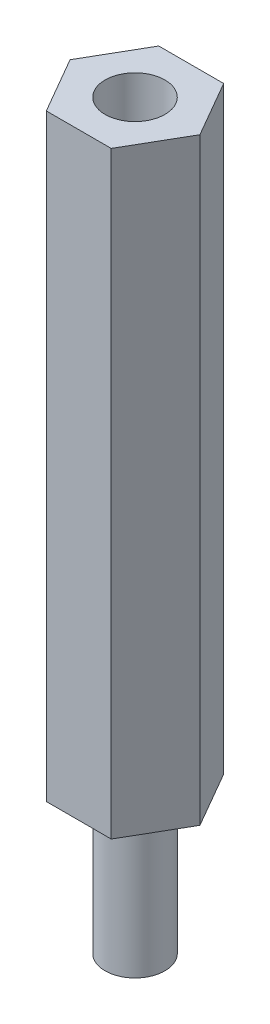
ISO-10303-21;
HEADER;
FILE_DESCRIPTION(('STEP AP214'),'2;1');
FILE_NAME('part.step','',(''),(''),'','','');
FILE_SCHEMA(('AUTOMOTIVE_DESIGN { 1 0 10303 214 1 1 1 1 }'));
ENDSEC;
DATA;
#1=APPLICATION_CONTEXT('core data for automotive mechanical design processes');
#2=APPLICATION_PROTOCOL_DEFINITION('international standard','automotive_design',2000,#1);
#3=PRODUCT_CONTEXT('',#1,'mechanical');
#4=PRODUCT('Part','Part','',(#3));
#5=PRODUCT_RELATED_PRODUCT_CATEGORY('part','',(#4));
#6=PRODUCT_DEFINITION_FORMATION('','',#4);
#7=PRODUCT_DEFINITION_CONTEXT('part definition',#1,'design');
#8=PRODUCT_DEFINITION('design','',#6,#7);
#9=PRODUCT_DEFINITION_SHAPE('','',#8);
#10=(LENGTH_UNIT() NAMED_UNIT(*) SI_UNIT(.MILLI.,.METRE.));
#11=(NAMED_UNIT(*) PLANE_ANGLE_UNIT() SI_UNIT($,.RADIAN.));
#12=(NAMED_UNIT(*) SI_UNIT($,.STERADIAN.) SOLID_ANGLE_UNIT());
#13=UNCERTAINTY_MEASURE_WITH_UNIT(LENGTH_MEASURE(1.E-05),#10,'distance_accuracy_value','');
#14=(GEOMETRIC_REPRESENTATION_CONTEXT(3) GLOBAL_UNCERTAINTY_ASSIGNED_CONTEXT((#13)) GLOBAL_UNIT_ASSIGNED_CONTEXT((#10,
#11,#12)) REPRESENTATION_CONTEXT('',''));
#15=CARTESIAN_POINT('',(0.,0.,0.));
#16=DIRECTION('',(0.,0.,1.));
#17=DIRECTION('',(1.,0.,0.));
#18=AXIS2_PLACEMENT_3D('',#15,#16,#17);
#19=CARTESIAN_POINT('',(0.,25.,0.));
#20=DIRECTION('',(0.,1.,0.));
#21=DIRECTION('',(0.,0.,1.));
#22=AXIS2_PLACEMENT_3D('',#19,#20,#21);
#23=PLANE('',#22);
#24=DIRECTION('',(-0.5,0.,-0.866025403784438));
#25=VECTOR('',#24,1.);
#26=CARTESIAN_POINT('',(2.71354626519124,25.,0.));
#27=LINE('',#26,#25);
#28=CARTESIAN_POINT('',(2.71354626519124,25.,0.));
#29=VERTEX_POINT('',#28);
#30=CARTESIAN_POINT('',(1.35677313259562,25.,-2.35));
#31=VERTEX_POINT('',#30);
#32=EDGE_CURVE('E134',#29,#31,#27,.T.);
#33=ORIENTED_EDGE('',*,*,#32,.T.);
#34=DIRECTION('',(-1.,0.,0.));
#35=VECTOR('',#34,1.);
#36=CARTESIAN_POINT('',(1.35677313259562,25.,-2.35));
#37=LINE('',#36,#35);
#38=CARTESIAN_POINT('',(-1.35677313259562,25.,-2.35));
#39=VERTEX_POINT('',#38);
#40=EDGE_CURVE('E92',#31,#39,#37,.T.);
#41=ORIENTED_EDGE('',*,*,#40,.T.);
#42=DIRECTION('',(-0.5,0.,0.866025403784438));
#43=VECTOR('',#42,1.);
#44=CARTESIAN_POINT('',(-1.35677313259562,25.,-2.35));
#45=LINE('',#44,#43);
#46=CARTESIAN_POINT('',(-2.71354626519124,25.,0.));
#47=VERTEX_POINT('',#46);
#48=EDGE_CURVE('E105',#39,#47,#45,.T.);
#49=ORIENTED_EDGE('',*,*,#48,.T.);
#50=DIRECTION('',(0.5,0.,0.866025403784438));
#51=VECTOR('',#50,1.);
#52=CARTESIAN_POINT('',(-2.71354626519124,25.,0.));
#53=LINE('',#52,#51);
#54=CARTESIAN_POINT('',(-1.35677313259562,25.,2.35));
#55=VERTEX_POINT('',#54);
#56=EDGE_CURVE('E99',#47,#55,#53,.T.);
#57=ORIENTED_EDGE('',*,*,#56,.T.);
#58=DIRECTION('',(1.,0.,0.));
#59=VECTOR('',#58,1.);
#60=CARTESIAN_POINT('',(-1.35677313259562,25.,2.35));
#61=LINE('',#60,#59);
#62=CARTESIAN_POINT('',(1.35677313259562,25.,2.35));
#63=VERTEX_POINT('',#62);
#64=EDGE_CURVE('E103',#55,#63,#61,.T.);
#65=ORIENTED_EDGE('',*,*,#64,.T.);
#66=DIRECTION('',(0.5,0.,-0.866025403784439));
#67=VECTOR('',#66,1.);
#68=CARTESIAN_POINT('',(1.35677313259562,25.,2.35));
#69=LINE('',#68,#67);
#70=EDGE_CURVE('E54',#63,#29,#69,.T.);
#71=ORIENTED_EDGE('',*,*,#70,.T.);
#72=EDGE_LOOP('',(#33,#41,#49,#57,#65,#71));
#73=FACE_BOUND('',#72,.T.);
#74=CARTESIAN_POINT('',(0.,25.,0.));
#75=DIRECTION('',(0.,1.,0.));
#76=DIRECTION('',(0.,0.,1.));
#77=AXIS2_PLACEMENT_3D('',#74,#75,#76);
#78=CIRCLE('',#77,1.25);
#79=CARTESIAN_POINT('',(0.,25.,1.25));
#80=VERTEX_POINT('',#79);
#81=EDGE_CURVE('E127',#80,#80,#78,.T.);
#82=ORIENTED_EDGE('',*,*,#81,.F.);
#83=EDGE_LOOP('',(#82));
#84=FACE_BOUND('',#83,.T.);
#85=ADVANCED_FACE('F37',(#73,#84),#23,.T.);
#86=CARTESIAN_POINT('',(0.,0.,0.));
#87=DIRECTION('',(0.,1.,0.));
#88=DIRECTION('',(0.,0.,1.));
#89=AXIS2_PLACEMENT_3D('',#86,#87,#88);
#90=PLANE('',#89);
#91=DIRECTION('',(-0.5,0.,-0.866025403784438));
#92=VECTOR('',#91,1.);
#93=CARTESIAN_POINT('',(2.71354626519124,0.,0.));
#94=LINE('',#93,#92);
#95=CARTESIAN_POINT('',(2.71354626519124,0.,0.));
#96=VERTEX_POINT('',#95);
#97=CARTESIAN_POINT('',(1.35677313259562,0.,-2.35));
#98=VERTEX_POINT('',#97);
#99=EDGE_CURVE('E123',#96,#98,#94,.T.);
#100=ORIENTED_EDGE('',*,*,#99,.F.);
#101=DIRECTION('',(0.5,0.,-0.866025403784439));
#102=VECTOR('',#101,1.);
#103=CARTESIAN_POINT('',(1.35677313259562,0.,2.35));
#104=LINE('',#103,#102);
#105=CARTESIAN_POINT('',(1.35677313259562,0.,2.35));
#106=VERTEX_POINT('',#105);
#107=EDGE_CURVE('E83',#106,#96,#104,.T.);
#108=ORIENTED_EDGE('',*,*,#107,.F.);
#109=DIRECTION('',(1.,0.,0.));
#110=VECTOR('',#109,1.);
#111=CARTESIAN_POINT('',(-1.35677313259562,0.,2.35));
#112=LINE('',#111,#110);
#113=CARTESIAN_POINT('',(-1.35677313259562,0.,2.35));
#114=VERTEX_POINT('',#113);
#115=EDGE_CURVE('E77',#114,#106,#112,.T.);
#116=ORIENTED_EDGE('',*,*,#115,.F.);
#117=DIRECTION('',(0.5,0.,0.866025403784438));
#118=VECTOR('',#117,1.);
#119=CARTESIAN_POINT('',(-2.71354626519124,0.,0.));
#120=LINE('',#119,#118);
#121=CARTESIAN_POINT('',(-2.71354626519124,0.,0.));
#122=VERTEX_POINT('',#121);
#123=EDGE_CURVE('E113',#122,#114,#120,.T.);
#124=ORIENTED_EDGE('',*,*,#123,.F.);
#125=DIRECTION('',(-0.5,0.,0.866025403784438));
#126=VECTOR('',#125,1.);
#127=CARTESIAN_POINT('',(-1.35677313259562,0.,-2.35));
#128=LINE('',#127,#126);
#129=CARTESIAN_POINT('',(-1.35677313259562,0.,-2.35));
#130=VERTEX_POINT('',#129);
#131=EDGE_CURVE('E129',#130,#122,#128,.T.);
#132=ORIENTED_EDGE('',*,*,#131,.F.);
#133=DIRECTION('',(-1.,0.,0.));
#134=VECTOR('',#133,1.);
#135=CARTESIAN_POINT('',(1.35677313259562,0.,-2.35));
#136=LINE('',#135,#134);
#137=EDGE_CURVE('E126',#98,#130,#136,.T.);
#138=ORIENTED_EDGE('',*,*,#137,.F.);
#139=EDGE_LOOP('',(#100,#108,#116,#124,#132,#138));
#140=FACE_BOUND('',#139,.T.);
#141=CARTESIAN_POINT('',(0.,0.,0.));
#142=DIRECTION('',(0.,1.,0.));
#143=DIRECTION('',(0.,0.,1.));
#144=AXIS2_PLACEMENT_3D('',#141,#142,#143);
#145=CIRCLE('',#144,1.25);
#146=CARTESIAN_POINT('',(0.,0.,1.25));
#147=VERTEX_POINT('',#146);
#148=EDGE_CURVE('E156',#147,#147,#145,.F.);
#149=ORIENTED_EDGE('',*,*,#148,.F.);
#150=EDGE_LOOP('',(#149));
#151=FACE_BOUND('',#150,.T.);
#152=ADVANCED_FACE('F146',(#140,#151),#90,.F.);
#153=CARTESIAN_POINT('',(2.71354626519124,25.,0.));
#154=DIRECTION('',(-0.866025403784438,0.,0.5));
#155=DIRECTION('',(0.5,0.,0.866025403784439));
#156=AXIS2_PLACEMENT_3D('',#153,#154,#155);
#157=PLANE('',#156);
#158=ORIENTED_EDGE('',*,*,#99,.T.);
#159=DIRECTION('',(0.,-1.,0.));
#160=VECTOR('',#159,1.);
#161=CARTESIAN_POINT('',(1.35677313259562,25.,-2.35));
#162=LINE('',#161,#160);
#163=EDGE_CURVE('E46',#31,#98,#162,.T.);
#164=ORIENTED_EDGE('',*,*,#163,.F.);
#165=ORIENTED_EDGE('',*,*,#32,.F.);
#166=DIRECTION('',(0.,-1.,0.));
#167=VECTOR('',#166,1.);
#168=CARTESIAN_POINT('',(2.71354626519124,25.,0.));
#169=LINE('',#168,#167);
#170=EDGE_CURVE('E119',#29,#96,#169,.T.);
#171=ORIENTED_EDGE('',*,*,#170,.T.);
#172=EDGE_LOOP('',(#158,#164,#165,#171));
#173=FACE_BOUND('',#172,.T.);
#174=ADVANCED_FACE('F39',(#173),#157,.F.);
#175=CARTESIAN_POINT('',(1.35677313259562,25.,-2.35));
#176=DIRECTION('',(0.,0.,1.));
#177=DIRECTION('',(1.,0.,0.));
#178=AXIS2_PLACEMENT_3D('',#175,#176,#177);
#179=PLANE('',#178);
#180=ORIENTED_EDGE('',*,*,#137,.T.);
#181=DIRECTION('',(0.,-1.,0.));
#182=VECTOR('',#181,1.);
#183=CARTESIAN_POINT('',(-1.35677313259562,25.,-2.35));
#184=LINE('',#183,#182);
#185=EDGE_CURVE('E138',#39,#130,#184,.T.);
#186=ORIENTED_EDGE('',*,*,#185,.F.);
#187=ORIENTED_EDGE('',*,*,#40,.F.);
#188=ORIENTED_EDGE('',*,*,#163,.T.);
#189=EDGE_LOOP('',(#180,#186,#187,#188));
#190=FACE_BOUND('',#189,.T.);
#191=ADVANCED_FACE('F141',(#190),#179,.F.);
#192=CARTESIAN_POINT('',(-1.35677313259562,25.,-2.35));
#193=DIRECTION('',(0.866025403784438,0.,0.5));
#194=DIRECTION('',(0.5,0.,-0.866025403784439));
#195=AXIS2_PLACEMENT_3D('',#192,#193,#194);
#196=PLANE('',#195);
#197=ORIENTED_EDGE('',*,*,#131,.T.);
#198=DIRECTION('',(0.,-1.,0.));
#199=VECTOR('',#198,1.);
#200=CARTESIAN_POINT('',(-2.71354626519124,25.,0.));
#201=LINE('',#200,#199);
#202=EDGE_CURVE('E114',#47,#122,#201,.T.);
#203=ORIENTED_EDGE('',*,*,#202,.F.);
#204=ORIENTED_EDGE('',*,*,#48,.F.);
#205=ORIENTED_EDGE('',*,*,#185,.T.);
#206=EDGE_LOOP('',(#197,#203,#204,#205));
#207=FACE_BOUND('',#206,.T.);
#208=ADVANCED_FACE('F150',(#207),#196,.F.);
#209=CARTESIAN_POINT('',(-2.71354626519124,25.,0.));
#210=DIRECTION('',(0.866025403784438,0.,-0.5));
#211=DIRECTION('',(-0.5,0.,-0.866025403784439));
#212=AXIS2_PLACEMENT_3D('',#209,#210,#211);
#213=PLANE('',#212);
#214=ORIENTED_EDGE('',*,*,#123,.T.);
#215=DIRECTION('',(0.,-1.,0.));
#216=VECTOR('',#215,1.);
#217=CARTESIAN_POINT('',(-1.35677313259562,25.,2.35));
#218=LINE('',#217,#216);
#219=EDGE_CURVE('E110',#55,#114,#218,.T.);
#220=ORIENTED_EDGE('',*,*,#219,.F.);
#221=ORIENTED_EDGE('',*,*,#56,.F.);
#222=ORIENTED_EDGE('',*,*,#202,.T.);
#223=EDGE_LOOP('',(#214,#220,#221,#222));
#224=FACE_BOUND('',#223,.T.);
#225=ADVANCED_FACE('F111',(#224),#213,.F.);
#226=CARTESIAN_POINT('',(-1.35677313259562,25.,2.35));
#227=DIRECTION('',(0.,0.,-1.));
#228=DIRECTION('',(-1.,0.,0.));
#229=AXIS2_PLACEMENT_3D('',#226,#227,#228);
#230=PLANE('',#229);
#231=ORIENTED_EDGE('',*,*,#115,.T.);
#232=DIRECTION('',(0.,-1.,0.));
#233=VECTOR('',#232,1.);
#234=CARTESIAN_POINT('',(1.35677313259562,25.,2.35));
#235=LINE('',#234,#233);
#236=EDGE_CURVE('E115',#63,#106,#235,.T.);
#237=ORIENTED_EDGE('',*,*,#236,.F.);
#238=ORIENTED_EDGE('',*,*,#64,.F.);
#239=ORIENTED_EDGE('',*,*,#219,.T.);
#240=EDGE_LOOP('',(#231,#237,#238,#239));
#241=FACE_BOUND('',#240,.T.);
#242=ADVANCED_FACE('F117',(#241),#230,.F.);
#243=CARTESIAN_POINT('',(1.35677313259562,25.,2.35));
#244=DIRECTION('',(-0.866025403784439,0.,-0.5));
#245=DIRECTION('',(-0.5,0.,0.866025403784439));
#246=AXIS2_PLACEMENT_3D('',#243,#244,#245);
#247=PLANE('',#246);
#248=ORIENTED_EDGE('',*,*,#107,.T.);
#249=ORIENTED_EDGE('',*,*,#170,.F.);
#250=ORIENTED_EDGE('',*,*,#70,.F.);
#251=ORIENTED_EDGE('',*,*,#236,.T.);
#252=EDGE_LOOP('',(#248,#249,#250,#251));
#253=FACE_BOUND('',#252,.T.);
#254=ADVANCED_FACE('F184',(#253),#247,.F.);
#255=CARTESIAN_POINT('',(0.,25.,0.));
#256=DIRECTION('',(0.,-1.,0.));
#257=DIRECTION('',(0.,0.,-1.));
#258=AXIS2_PLACEMENT_3D('',#255,#256,#257);
#259=CYLINDRICAL_SURFACE('',#258,1.25);
#260=CARTESIAN_POINT('',(0.,19.,0.));
#261=DIRECTION('',(0.,1.,0.));
#262=DIRECTION('',(0.,0.,1.));
#263=AXIS2_PLACEMENT_3D('',#260,#261,#262);
#264=CIRCLE('',#263,1.25);
#265=CARTESIAN_POINT('',(0.,19.,1.25));
#266=VERTEX_POINT('',#265);
#267=EDGE_CURVE('E11',#266,#266,#264,.T.);
#268=ORIENTED_EDGE('',*,*,#267,.F.);
#269=EDGE_LOOP('',(#268));
#270=FACE_BOUND('',#269,.T.);
#271=ORIENTED_EDGE('',*,*,#81,.T.);
#272=EDGE_LOOP('',(#271));
#273=FACE_BOUND('',#272,.T.);
#274=ADVANCED_FACE('F182',(#270,#273),#259,.F.);
#275=CARTESIAN_POINT('',(0.,19.,0.));
#276=DIRECTION('',(0.,1.,0.));
#277=DIRECTION('',(0.,0.,1.));
#278=AXIS2_PLACEMENT_3D('',#275,#276,#277);
#279=PLANE('',#278);
#280=ORIENTED_EDGE('',*,*,#267,.T.);
#281=EDGE_LOOP('',(#280));
#282=FACE_BOUND('',#281,.T.);
#283=ADVANCED_FACE('F172',(#282),#279,.T.);
#284=CARTESIAN_POINT('',(0.,19.,0.));
#285=DIRECTION('',(0.,-1.,0.));
#286=DIRECTION('',(0.,0.,-1.));
#287=AXIS2_PLACEMENT_3D('',#284,#285,#286);
#288=CYLINDRICAL_SURFACE('',#287,1.25);
#289=CARTESIAN_POINT('',(0.,-6.,0.));
#290=DIRECTION('',(0.,1.,0.));
#291=DIRECTION('',(0.,0.,1.));
#292=AXIS2_PLACEMENT_3D('',#289,#290,#291);
#293=CIRCLE('',#292,1.25);
#294=CARTESIAN_POINT('',(0.,-6.,1.25));
#295=VERTEX_POINT('',#294);
#296=EDGE_CURVE('E159',#295,#295,#293,.T.);
#297=ORIENTED_EDGE('',*,*,#296,.T.);
#298=EDGE_LOOP('',(#297));
#299=FACE_BOUND('',#298,.T.);
#300=ORIENTED_EDGE('',*,*,#148,.T.);
#301=EDGE_LOOP('',(#300));
#302=FACE_BOUND('',#301,.T.);
#303=ADVANCED_FACE('F163',(#299,#302),#288,.T.);
#304=CARTESIAN_POINT('',(0.,-6.,0.));
#305=DIRECTION('',(0.,1.,0.));
#306=DIRECTION('',(0.,0.,1.));
#307=AXIS2_PLACEMENT_3D('',#304,#305,#306);
#308=PLANE('',#307);
#309=ORIENTED_EDGE('',*,*,#296,.F.);
#310=EDGE_LOOP('',(#309));
#311=FACE_BOUND('',#310,.T.);
#312=ADVANCED_FACE('F166',(#311),#308,.F.);
#313=CLOSED_SHELL('',(#85,#152,#174,#191,#208,#225,#242,#254,#274,#283,#303,#312));
#314=MANIFOLD_SOLID_BREP('B2',#313);
#315=ADVANCED_BREP_SHAPE_REPRESENTATION('',(#18,#314),#14);
#316=SHAPE_DEFINITION_REPRESENTATION(#9,#315);
ENDSEC;
END-ISO-10303-21;
